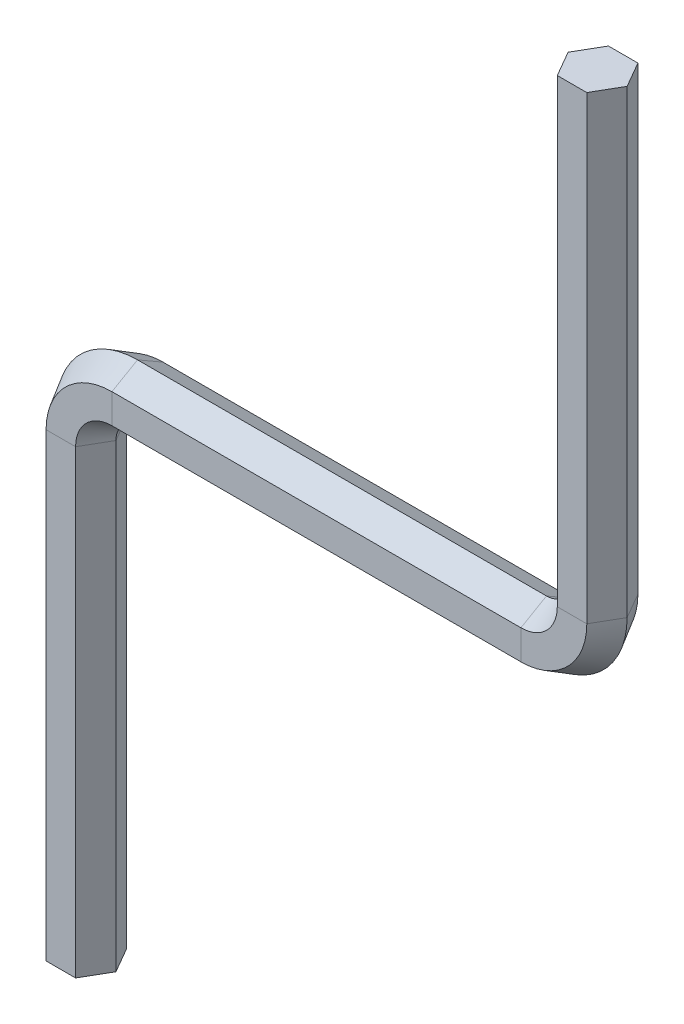
ISO-10303-21;
HEADER;
FILE_DESCRIPTION(('STEP AP214'),'2;1');
FILE_NAME('part.step','',(''),(''),'','','');
FILE_SCHEMA(('AUTOMOTIVE_DESIGN { 1 0 10303 214 1 1 1 1 }'));
ENDSEC;
DATA;
#1=APPLICATION_CONTEXT('core data for automotive mechanical design processes');
#2=APPLICATION_PROTOCOL_DEFINITION('international standard','automotive_design',2000,#1);
#3=PRODUCT_CONTEXT('',#1,'mechanical');
#4=PRODUCT('Part','Part','',(#3));
#5=PRODUCT_RELATED_PRODUCT_CATEGORY('part','',(#4));
#6=PRODUCT_DEFINITION_FORMATION('','',#4);
#7=PRODUCT_DEFINITION_CONTEXT('part definition',#1,'design');
#8=PRODUCT_DEFINITION('design','',#6,#7);
#9=PRODUCT_DEFINITION_SHAPE('','',#8);
#10=(LENGTH_UNIT() NAMED_UNIT(*) SI_UNIT(.MILLI.,.METRE.));
#11=(NAMED_UNIT(*) PLANE_ANGLE_UNIT() SI_UNIT($,.RADIAN.));
#12=(NAMED_UNIT(*) SI_UNIT($,.STERADIAN.) SOLID_ANGLE_UNIT());
#13=UNCERTAINTY_MEASURE_WITH_UNIT(LENGTH_MEASURE(1.E-05),#10,'distance_accuracy_value','');
#14=(GEOMETRIC_REPRESENTATION_CONTEXT(3) GLOBAL_UNCERTAINTY_ASSIGNED_CONTEXT((#13)) GLOBAL_UNIT_ASSIGNED_CONTEXT((#10,
#11,#12)) REPRESENTATION_CONTEXT('',''));
#15=CARTESIAN_POINT('',(0.,0.,0.));
#16=DIRECTION('',(0.,0.,1.));
#17=DIRECTION('',(1.,0.,0.));
#18=AXIS2_PLACEMENT_3D('',#15,#16,#17);
#19=CARTESIAN_POINT('',(0.,0.,0.));
#20=DIRECTION('',(0.,1.,0.));
#21=DIRECTION('',(0.,0.,1.));
#22=AXIS2_PLACEMENT_3D('',#19,#20,#21);
#23=PLANE('',#22);
#24=DIRECTION('',(0.5,0.,0.866025403784439));
#25=VECTOR('',#24,1.);
#26=CARTESIAN_POINT('',(-28.8675134594813,0.,0.));
#27=LINE('',#26,#25);
#28=CARTESIAN_POINT('',(-28.8675134594813,0.,0.));
#29=VERTEX_POINT('',#28);
#30=CARTESIAN_POINT('',(-14.4337567297407,0.,25.));
#31=VERTEX_POINT('',#30);
#32=EDGE_CURVE('E211',#29,#31,#27,.T.);
#33=ORIENTED_EDGE('',*,*,#32,.F.);
#34=DIRECTION('',(-0.5,0.,0.866025403784439));
#35=VECTOR('',#34,1.);
#36=CARTESIAN_POINT('',(-14.4337567297406,0.,-25.));
#37=LINE('',#36,#35);
#38=CARTESIAN_POINT('',(-14.4337567297406,0.,-25.));
#39=VERTEX_POINT('',#38);
#40=EDGE_CURVE('E213',#39,#29,#37,.T.);
#41=ORIENTED_EDGE('',*,*,#40,.F.);
#42=DIRECTION('',(-1.,0.,0.));
#43=VECTOR('',#42,1.);
#44=CARTESIAN_POINT('',(14.4337567297406,0.,-25.));
#45=LINE('',#44,#43);
#46=CARTESIAN_POINT('',(14.4337567297406,0.,-25.));
#47=VERTEX_POINT('',#46);
#48=EDGE_CURVE('E230',#47,#39,#45,.T.);
#49=ORIENTED_EDGE('',*,*,#48,.F.);
#50=DIRECTION('',(-0.5,0.,-0.866025403784438));
#51=VECTOR('',#50,1.);
#52=CARTESIAN_POINT('',(28.8675134594813,0.,0.));
#53=LINE('',#52,#51);
#54=CARTESIAN_POINT('',(28.8675134594813,0.,0.));
#55=VERTEX_POINT('',#54);
#56=EDGE_CURVE('E306',#55,#47,#53,.T.);
#57=ORIENTED_EDGE('',*,*,#56,.F.);
#58=DIRECTION('',(0.5,0.,-0.866025403784439));
#59=VECTOR('',#58,1.);
#60=CARTESIAN_POINT('',(14.4337567297407,0.,25.));
#61=LINE('',#60,#59);
#62=CARTESIAN_POINT('',(14.4337567297407,0.,25.));
#63=VERTEX_POINT('',#62);
#64=EDGE_CURVE('E281',#63,#55,#61,.T.);
#65=ORIENTED_EDGE('',*,*,#64,.F.);
#66=DIRECTION('',(1.,0.,0.));
#67=VECTOR('',#66,1.);
#68=CARTESIAN_POINT('',(-14.4337567297407,0.,25.));
#69=LINE('',#68,#67);
#70=EDGE_CURVE('E216',#31,#63,#69,.T.);
#71=ORIENTED_EDGE('',*,*,#70,.F.);
#72=EDGE_LOOP('',(#33,#41,#49,#57,#65,#71));
#73=FACE_BOUND('',#72,.T.);
#74=ADVANCED_FACE('F35',(#73),#23,.F.);
#75=CARTESIAN_POINT('',(500.,1000.,0.));
#76=DIRECTION('',(0.,1.,0.));
#77=DIRECTION('',(0.,0.,1.));
#78=AXIS2_PLACEMENT_3D('',#75,#76,#77);
#79=PLANE('',#78);
#80=DIRECTION('',(0.5,0.,0.866025403784439));
#81=VECTOR('',#80,1.);
#82=CARTESIAN_POINT('',(471.132486540519,1000.,0.));
#83=LINE('',#82,#81);
#84=CARTESIAN_POINT('',(471.132486540519,1000.,0.));
#85=VERTEX_POINT('',#84);
#86=CARTESIAN_POINT('',(485.566243270259,1000.,25.));
#87=VERTEX_POINT('',#86);
#88=EDGE_CURVE('E270',#85,#87,#83,.T.);
#89=ORIENTED_EDGE('',*,*,#88,.T.);
#90=DIRECTION('',(1.,0.,0.));
#91=VECTOR('',#90,1.);
#92=CARTESIAN_POINT('',(485.566243270259,1000.,25.));
#93=LINE('',#92,#91);
#94=CARTESIAN_POINT('',(514.433756729741,1000.,25.));
#95=VERTEX_POINT('',#94);
#96=EDGE_CURVE('E276',#87,#95,#93,.T.);
#97=ORIENTED_EDGE('',*,*,#96,.T.);
#98=DIRECTION('',(0.5,0.,-0.866025403784439));
#99=VECTOR('',#98,1.);
#100=CARTESIAN_POINT('',(514.433756729741,1000.,25.));
#101=LINE('',#100,#99);
#102=CARTESIAN_POINT('',(528.867513459481,1000.,0.));
#103=VERTEX_POINT('',#102);
#104=EDGE_CURVE('E303',#95,#103,#101,.T.);
#105=ORIENTED_EDGE('',*,*,#104,.T.);
#106=DIRECTION('',(-0.5,0.,-0.866025403784438));
#107=VECTOR('',#106,1.);
#108=CARTESIAN_POINT('',(528.867513459481,1000.,0.));
#109=LINE('',#108,#107);
#110=CARTESIAN_POINT('',(514.433756729741,1000.,-25.));
#111=VERTEX_POINT('',#110);
#112=EDGE_CURVE('E54',#103,#111,#109,.T.);
#113=ORIENTED_EDGE('',*,*,#112,.T.);
#114=DIRECTION('',(-1.,0.,0.));
#115=VECTOR('',#114,1.);
#116=CARTESIAN_POINT('',(514.433756729741,1000.,-25.));
#117=LINE('',#116,#115);
#118=CARTESIAN_POINT('',(485.566243270259,1000.,-25.));
#119=VERTEX_POINT('',#118);
#120=EDGE_CURVE('E48',#111,#119,#117,.T.);
#121=ORIENTED_EDGE('',*,*,#120,.T.);
#122=DIRECTION('',(-0.5,0.,0.866025403784439));
#123=VECTOR('',#122,1.);
#124=CARTESIAN_POINT('',(485.566243270259,1000.,-25.));
#125=LINE('',#124,#123);
#126=EDGE_CURVE('E11',#119,#85,#125,.T.);
#127=ORIENTED_EDGE('',*,*,#126,.T.);
#128=EDGE_LOOP('',(#89,#97,#105,#113,#121,#127));
#129=FACE_BOUND('',#128,.T.);
#130=ADVANCED_FACE('F418',(#129),#79,.T.);
#131=CARTESIAN_POINT('',(-28.8675134594813,0.,0.));
#132=DIRECTION('',(-0.866025403784439,0.,0.5));
#133=DIRECTION('',(0.5,0.,0.866025403784439));
#134=AXIS2_PLACEMENT_3D('',#131,#132,#133);
#135=PLANE('',#134);
#136=DIRECTION('',(0.,1.,0.));
#137=VECTOR('',#136,1.);
#138=CARTESIAN_POINT('',(-14.4337567297407,0.,25.));
#139=LINE('',#138,#137);
#140=CARTESIAN_POINT('',(-14.4337567297407,450.,25.));
#141=VERTEX_POINT('',#140);
#142=EDGE_CURVE('E237',#31,#141,#139,.T.);
#143=ORIENTED_EDGE('',*,*,#142,.T.);
#144=DIRECTION('',(0.5,0.,0.866025403784439));
#145=VECTOR('',#144,1.);
#146=CARTESIAN_POINT('',(-28.8675134594813,450.,0.));
#147=LINE('',#146,#145);
#148=CARTESIAN_POINT('',(-28.8675134594813,450.,0.));
#149=VERTEX_POINT('',#148);
#150=EDGE_CURVE('E235',#149,#141,#147,.T.);
#151=ORIENTED_EDGE('',*,*,#150,.F.);
#152=DIRECTION('',(0.,1.,0.));
#153=VECTOR('',#152,1.);
#154=CARTESIAN_POINT('',(-28.8675134594813,0.,0.));
#155=LINE('',#154,#153);
#156=EDGE_CURVE('E227',#29,#149,#155,.T.);
#157=ORIENTED_EDGE('',*,*,#156,.F.);
#158=ORIENTED_EDGE('',*,*,#32,.T.);
#159=EDGE_LOOP('',(#143,#151,#157,#158));
#160=FACE_BOUND('',#159,.T.);
#161=ADVANCED_FACE('F233',(#160),#135,.T.);
#162=CARTESIAN_POINT('',(-14.4337567297407,0.,25.));
#163=DIRECTION('',(0.,0.,1.));
#164=DIRECTION('',(1.,0.,0.));
#165=AXIS2_PLACEMENT_3D('',#162,#163,#164);
#166=PLANE('',#165);
#167=DIRECTION('',(0.,1.,0.));
#168=VECTOR('',#167,1.);
#169=CARTESIAN_POINT('',(14.4337567297407,0.,25.));
#170=LINE('',#169,#168);
#171=CARTESIAN_POINT('',(14.4337567297407,450.,25.));
#172=VERTEX_POINT('',#171);
#173=EDGE_CURVE('E284',#63,#172,#170,.T.);
#174=ORIENTED_EDGE('',*,*,#173,.T.);
#175=DIRECTION('',(1.,0.,0.));
#176=VECTOR('',#175,1.);
#177=CARTESIAN_POINT('',(-14.4337567297407,450.,25.));
#178=LINE('',#177,#176);
#179=EDGE_CURVE('E282',#141,#172,#178,.T.);
#180=ORIENTED_EDGE('',*,*,#179,.F.);
#181=ORIENTED_EDGE('',*,*,#142,.F.);
#182=ORIENTED_EDGE('',*,*,#70,.T.);
#183=EDGE_LOOP('',(#174,#180,#181,#182));
#184=FACE_BOUND('',#183,.T.);
#185=ADVANCED_FACE('F445',(#184),#166,.T.);
#186=CARTESIAN_POINT('',(14.4337567297407,0.,25.));
#187=DIRECTION('',(0.866025403784439,0.,0.5));
#188=DIRECTION('',(0.5,0.,-0.866025403784439));
#189=AXIS2_PLACEMENT_3D('',#186,#187,#188);
#190=PLANE('',#189);
#191=DIRECTION('',(0.,1.,0.));
#192=VECTOR('',#191,1.);
#193=CARTESIAN_POINT('',(28.8675134594813,0.,0.));
#194=LINE('',#193,#192);
#195=CARTESIAN_POINT('',(28.8675134594813,450.,0.));
#196=VERTEX_POINT('',#195);
#197=EDGE_CURVE('E308',#55,#196,#194,.T.);
#198=ORIENTED_EDGE('',*,*,#197,.T.);
#199=DIRECTION('',(0.5,0.,-0.866025403784439));
#200=VECTOR('',#199,1.);
#201=CARTESIAN_POINT('',(14.4337567297407,450.,25.));
#202=LINE('',#201,#200);
#203=EDGE_CURVE('E287',#172,#196,#202,.T.);
#204=ORIENTED_EDGE('',*,*,#203,.F.);
#205=ORIENTED_EDGE('',*,*,#173,.F.);
#206=ORIENTED_EDGE('',*,*,#64,.T.);
#207=EDGE_LOOP('',(#198,#204,#205,#206));
#208=FACE_BOUND('',#207,.T.);
#209=ADVANCED_FACE('F468',(#208),#190,.T.);
#210=CARTESIAN_POINT('',(28.8675134594813,0.,0.));
#211=DIRECTION('',(0.866025403784439,0.,-0.5));
#212=DIRECTION('',(-0.5,0.,-0.866025403784438));
#213=AXIS2_PLACEMENT_3D('',#210,#211,#212);
#214=PLANE('',#213);
#215=DIRECTION('',(0.,1.,0.));
#216=VECTOR('',#215,1.);
#217=CARTESIAN_POINT('',(14.4337567297406,0.,-25.));
#218=LINE('',#217,#216);
#219=CARTESIAN_POINT('',(14.4337567297406,450.,-25.));
#220=VERTEX_POINT('',#219);
#221=EDGE_CURVE('E330',#47,#220,#218,.T.);
#222=ORIENTED_EDGE('',*,*,#221,.T.);
#223=DIRECTION('',(-0.5,0.,-0.866025403784438));
#224=VECTOR('',#223,1.);
#225=CARTESIAN_POINT('',(28.8675134594813,450.,0.));
#226=LINE('',#225,#224);
#227=EDGE_CURVE('E311',#196,#220,#226,.T.);
#228=ORIENTED_EDGE('',*,*,#227,.F.);
#229=ORIENTED_EDGE('',*,*,#197,.F.);
#230=ORIENTED_EDGE('',*,*,#56,.T.);
#231=EDGE_LOOP('',(#222,#228,#229,#230));
#232=FACE_BOUND('',#231,.T.);
#233=ADVANCED_FACE('F478',(#232),#214,.T.);
#234=CARTESIAN_POINT('',(14.4337567297406,0.,-25.));
#235=DIRECTION('',(0.,0.,-1.));
#236=DIRECTION('',(-1.,0.,0.));
#237=AXIS2_PLACEMENT_3D('',#234,#235,#236);
#238=PLANE('',#237);
#239=DIRECTION('',(0.,1.,0.));
#240=VECTOR('',#239,1.);
#241=CARTESIAN_POINT('',(-14.4337567297406,0.,-25.));
#242=LINE('',#241,#240);
#243=CARTESIAN_POINT('',(-14.4337567297406,450.,-25.));
#244=VERTEX_POINT('',#243);
#245=EDGE_CURVE('E229',#39,#244,#242,.T.);
#246=ORIENTED_EDGE('',*,*,#245,.T.);
#247=DIRECTION('',(-1.,0.,0.));
#248=VECTOR('',#247,1.);
#249=CARTESIAN_POINT('',(14.4337567297406,450.,-25.));
#250=LINE('',#249,#248);
#251=EDGE_CURVE('E333',#220,#244,#250,.T.);
#252=ORIENTED_EDGE('',*,*,#251,.F.);
#253=ORIENTED_EDGE('',*,*,#221,.F.);
#254=ORIENTED_EDGE('',*,*,#48,.T.);
#255=EDGE_LOOP('',(#246,#252,#253,#254));
#256=FACE_BOUND('',#255,.T.);
#257=ADVANCED_FACE('F394',(#256),#238,.T.);
#258=CARTESIAN_POINT('',(-14.4337567297406,0.,-25.));
#259=DIRECTION('',(-0.866025403784439,0.,-0.5));
#260=DIRECTION('',(-0.5,0.,0.866025403784439));
#261=AXIS2_PLACEMENT_3D('',#258,#259,#260);
#262=PLANE('',#261);
#263=DIRECTION('',(-0.5,0.,0.866025403784439));
#264=VECTOR('',#263,1.);
#265=CARTESIAN_POINT('',(-14.4337567297406,450.,-25.));
#266=LINE('',#265,#264);
#267=EDGE_CURVE('E249',#244,#149,#266,.T.);
#268=ORIENTED_EDGE('',*,*,#267,.F.);
#269=ORIENTED_EDGE('',*,*,#245,.F.);
#270=ORIENTED_EDGE('',*,*,#40,.T.);
#271=ORIENTED_EDGE('',*,*,#156,.T.);
#272=EDGE_LOOP('',(#268,#269,#270,#271));
#273=FACE_BOUND('',#272,.T.);
#274=ADVANCED_FACE('F226',(#273),#262,.T.);
#275=CARTESIAN_POINT('',(50.,450.,0.));
#276=DIRECTION('',(0.,0.,-1.));
#277=DIRECTION('',(-1.,0.,0.));
#278=AXIS2_PLACEMENT_3D('',#275,#276,#277);
#279=CONICAL_SURFACE('',#278,78.8675134594813,0.523598775598299);
#280=CARTESIAN_POINT('',(50.,450.,25.));
#281=DIRECTION('',(0.,0.,-1.));
#282=DIRECTION('',(-1.,0.,0.));
#283=AXIS2_PLACEMENT_3D('',#280,#281,#282);
#284=CIRCLE('',#283,64.4337567297406);
#285=CARTESIAN_POINT('',(50.0000000000004,514.433756729741,25.));
#286=VERTEX_POINT('',#285);
#287=EDGE_CURVE('E200',#141,#286,#284,.T.);
#288=ORIENTED_EDGE('',*,*,#287,.T.);
#289=DIRECTION('',(0.,-0.5,0.866025403784439));
#290=VECTOR('',#289,1.);
#291=CARTESIAN_POINT('',(50.0000000000005,528.867513459481,0.));
#292=LINE('',#291,#290);
#293=CARTESIAN_POINT('',(50.0000000000006,528.867513459481,0.));
#294=VERTEX_POINT('',#293);
#295=EDGE_CURVE('E241',#294,#286,#292,.T.);
#296=ORIENTED_EDGE('',*,*,#295,.F.);
#297=CARTESIAN_POINT('',(50.,450.,0.));
#298=DIRECTION('',(0.,0.,-1.));
#299=DIRECTION('',(-1.,0.,0.));
#300=AXIS2_PLACEMENT_3D('',#297,#298,#299);
#301=CIRCLE('',#300,78.8675134594813);
#302=EDGE_CURVE('E244',#149,#294,#301,.T.);
#303=ORIENTED_EDGE('',*,*,#302,.F.);
#304=ORIENTED_EDGE('',*,*,#150,.T.);
#305=EDGE_LOOP('',(#288,#296,#303,#304));
#306=FACE_BOUND('',#305,.T.);
#307=ADVANCED_FACE('F390',(#306),#279,.T.);
#308=CARTESIAN_POINT('',(-14.4337567297406,450.,25.));
#309=DIRECTION('',(0.,0.,1.));
#310=DIRECTION('',(1.,0.,0.));
#311=AXIS2_PLACEMENT_3D('',#308,#309,#310);
#312=PLANE('',#311);
#313=CARTESIAN_POINT('',(50.,450.,25.));
#314=DIRECTION('',(0.,0.,-1.));
#315=DIRECTION('',(-1.,0.,0.));
#316=AXIS2_PLACEMENT_3D('',#313,#314,#315);
#317=CIRCLE('',#316,35.5662432702593);
#318=CARTESIAN_POINT('',(50.0000000000002,485.566243270259,25.));
#319=VERTEX_POINT('',#318);
#320=EDGE_CURVE('E194',#172,#319,#317,.T.);
#321=ORIENTED_EDGE('',*,*,#320,.T.);
#322=DIRECTION('',(0.,-1.,0.));
#323=VECTOR('',#322,1.);
#324=CARTESIAN_POINT('',(50.0000000000004,514.433756729741,25.));
#325=LINE('',#324,#323);
#326=EDGE_CURVE('E246',#286,#319,#325,.T.);
#327=ORIENTED_EDGE('',*,*,#326,.F.);
#328=ORIENTED_EDGE('',*,*,#287,.F.);
#329=ORIENTED_EDGE('',*,*,#179,.T.);
#330=EDGE_LOOP('',(#321,#327,#328,#329));
#331=FACE_BOUND('',#330,.T.);
#332=ADVANCED_FACE('F513',(#331),#312,.T.);
#333=CARTESIAN_POINT('',(50.,450.,25.));
#334=DIRECTION('',(0.,0.,1.));
#335=DIRECTION('',(1.,0.,0.));
#336=AXIS2_PLACEMENT_3D('',#333,#334,#335);
#337=CONICAL_SURFACE('',#336,35.5662432702593,0.523598775598299);
#338=CARTESIAN_POINT('',(50.,450.,0.));
#339=DIRECTION('',(0.,0.,-1.));
#340=DIRECTION('',(-1.,0.,0.));
#341=AXIS2_PLACEMENT_3D('',#338,#339,#340);
#342=CIRCLE('',#341,21.1324865405187);
#343=CARTESIAN_POINT('',(50.0000000000001,471.132486540519,0.));
#344=VERTEX_POINT('',#343);
#345=EDGE_CURVE('E313',#196,#344,#342,.T.);
#346=ORIENTED_EDGE('',*,*,#345,.T.);
#347=DIRECTION('',(0.,-0.5,-0.866025403784439));
#348=VECTOR('',#347,1.);
#349=CARTESIAN_POINT('',(50.0000000000002,485.566243270259,25.));
#350=LINE('',#349,#348);
#351=EDGE_CURVE('E290',#319,#344,#350,.T.);
#352=ORIENTED_EDGE('',*,*,#351,.F.);
#353=ORIENTED_EDGE('',*,*,#320,.F.);
#354=ORIENTED_EDGE('',*,*,#203,.T.);
#355=EDGE_LOOP('',(#346,#352,#353,#354));
#356=FACE_BOUND('',#355,.T.);
#357=ADVANCED_FACE('F522',(#356),#337,.F.);
#358=CARTESIAN_POINT('',(50.,450.,0.));
#359=DIRECTION('',(0.,0.,-1.));
#360=DIRECTION('',(-1.,0.,0.));
#361=AXIS2_PLACEMENT_3D('',#358,#359,#360);
#362=CONICAL_SURFACE('',#361,21.1324865405187,0.523598775598299);
#363=CARTESIAN_POINT('',(50.,450.,-25.));
#364=DIRECTION('',(0.,0.,-1.));
#365=DIRECTION('',(-1.,0.,0.));
#366=AXIS2_PLACEMENT_3D('',#363,#364,#365);
#367=CIRCLE('',#366,35.5662432702594);
#368=CARTESIAN_POINT('',(50.0000000000002,485.566243270259,-25.));
#369=VERTEX_POINT('',#368);
#370=EDGE_CURVE('E335',#220,#369,#367,.T.);
#371=ORIENTED_EDGE('',*,*,#370,.T.);
#372=DIRECTION('',(0.,0.5,-0.866025403784438));
#373=VECTOR('',#372,1.);
#374=CARTESIAN_POINT('',(50.0000000000001,471.132486540519,0.));
#375=LINE('',#374,#373);
#376=EDGE_CURVE('E316',#344,#369,#375,.T.);
#377=ORIENTED_EDGE('',*,*,#376,.F.);
#378=ORIENTED_EDGE('',*,*,#345,.F.);
#379=ORIENTED_EDGE('',*,*,#227,.T.);
#380=EDGE_LOOP('',(#371,#377,#378,#379));
#381=FACE_BOUND('',#380,.T.);
#382=ADVANCED_FACE('F400',(#381),#362,.F.);
#383=CARTESIAN_POINT('',(14.4337567297406,450.,-25.));
#384=DIRECTION('',(0.,0.,-1.));
#385=DIRECTION('',(-1.,0.,0.));
#386=AXIS2_PLACEMENT_3D('',#383,#384,#385);
#387=PLANE('',#386);
#388=CARTESIAN_POINT('',(50.,450.,-25.));
#389=DIRECTION('',(0.,0.,-1.));
#390=DIRECTION('',(-1.,0.,0.));
#391=AXIS2_PLACEMENT_3D('',#388,#389,#390);
#392=CIRCLE('',#391,64.4337567297406);
#393=CARTESIAN_POINT('',(50.0000000000004,514.433756729741,-25.));
#394=VERTEX_POINT('',#393);
#395=EDGE_CURVE('E355',#244,#394,#392,.T.);
#396=ORIENTED_EDGE('',*,*,#395,.T.);
#397=DIRECTION('',(0.,1.,0.));
#398=VECTOR('',#397,1.);
#399=CARTESIAN_POINT('',(50.0000000000002,485.566243270259,-25.));
#400=LINE('',#399,#398);
#401=EDGE_CURVE('E338',#369,#394,#400,.T.);
#402=ORIENTED_EDGE('',*,*,#401,.F.);
#403=ORIENTED_EDGE('',*,*,#370,.F.);
#404=ORIENTED_EDGE('',*,*,#251,.T.);
#405=EDGE_LOOP('',(#396,#402,#403,#404));
#406=FACE_BOUND('',#405,.T.);
#407=ADVANCED_FACE('F397',(#406),#387,.T.);
#408=CARTESIAN_POINT('',(50.,450.,-25.));
#409=DIRECTION('',(0.,0.,1.));
#410=DIRECTION('',(1.,0.,0.));
#411=AXIS2_PLACEMENT_3D('',#408,#409,#410);
#412=CONICAL_SURFACE('',#411,64.4337567297406,0.523598775598299);
#413=DIRECTION('',(0.,0.5,0.866025403784439));
#414=VECTOR('',#413,1.);
#415=CARTESIAN_POINT('',(50.0000000000004,514.433756729741,-25.));
#416=LINE('',#415,#414);
#417=EDGE_CURVE('E258',#394,#294,#416,.T.);
#418=ORIENTED_EDGE('',*,*,#417,.F.);
#419=ORIENTED_EDGE('',*,*,#395,.F.);
#420=ORIENTED_EDGE('',*,*,#267,.T.);
#421=ORIENTED_EDGE('',*,*,#302,.T.);
#422=EDGE_LOOP('',(#418,#419,#420,#421));
#423=FACE_BOUND('',#422,.T.);
#424=ADVANCED_FACE('F391',(#423),#412,.T.);
#425=CARTESIAN_POINT('',(50.0000000000004,528.867513459481,0.));
#426=DIRECTION('',(0.,0.866025403784439,0.5));
#427=DIRECTION('',(0.,-0.5,0.866025403784439));
#428=AXIS2_PLACEMENT_3D('',#425,#426,#427);
#429=PLANE('',#428);
#430=DIRECTION('',(1.,0.,0.));
#431=VECTOR('',#430,1.);
#432=CARTESIAN_POINT('',(50.0000000000004,514.433756729741,25.));
#433=LINE('',#432,#431);
#434=CARTESIAN_POINT('',(450.,514.433756729741,25.));
#435=VERTEX_POINT('',#434);
#436=EDGE_CURVE('E173',#286,#435,#433,.T.);
#437=ORIENTED_EDGE('',*,*,#436,.T.);
#438=DIRECTION('',(0.,-0.5,0.866025403784439));
#439=VECTOR('',#438,1.);
#440=CARTESIAN_POINT('',(450.,528.867513459481,0.));
#441=LINE('',#440,#439);
#442=CARTESIAN_POINT('',(450.,528.867513459481,0.));
#443=VERTEX_POINT('',#442);
#444=EDGE_CURVE('E250',#443,#435,#441,.T.);
#445=ORIENTED_EDGE('',*,*,#444,.F.);
#446=DIRECTION('',(1.,0.,0.));
#447=VECTOR('',#446,1.);
#448=CARTESIAN_POINT('',(50.0000000000004,528.867513459481,0.));
#449=LINE('',#448,#447);
#450=EDGE_CURVE('E253',#294,#443,#449,.T.);
#451=ORIENTED_EDGE('',*,*,#450,.F.);
#452=ORIENTED_EDGE('',*,*,#295,.T.);
#453=EDGE_LOOP('',(#437,#445,#451,#452));
#454=FACE_BOUND('',#453,.T.);
#455=ADVANCED_FACE('F384',(#454),#429,.T.);
#456=CARTESIAN_POINT('',(50.0000000000004,514.433756729741,25.));
#457=DIRECTION('',(0.,0.,1.));
#458=DIRECTION('',(0.,-1.,0.));
#459=AXIS2_PLACEMENT_3D('',#456,#457,#458);
#460=PLANE('',#459);
#461=DIRECTION('',(1.,0.,0.));
#462=VECTOR('',#461,1.);
#463=CARTESIAN_POINT('',(50.0000000000004,485.566243270259,25.));
#464=LINE('',#463,#462);
#465=CARTESIAN_POINT('',(450.,485.566243270259,25.));
#466=VERTEX_POINT('',#465);
#467=EDGE_CURVE('E165',#319,#466,#464,.T.);
#468=ORIENTED_EDGE('',*,*,#467,.T.);
#469=DIRECTION('',(0.,-1.,0.));
#470=VECTOR('',#469,1.);
#471=CARTESIAN_POINT('',(450.,514.433756729741,25.));
#472=LINE('',#471,#470);
#473=EDGE_CURVE('E255',#435,#466,#472,.T.);
#474=ORIENTED_EDGE('',*,*,#473,.F.);
#475=ORIENTED_EDGE('',*,*,#436,.F.);
#476=ORIENTED_EDGE('',*,*,#326,.T.);
#477=EDGE_LOOP('',(#468,#474,#475,#476));
#478=FACE_BOUND('',#477,.T.);
#479=ADVANCED_FACE('F562',(#478),#460,.T.);
#480=CARTESIAN_POINT('',(50.0000000000004,485.566243270259,25.));
#481=DIRECTION('',(0.,-0.866025403784439,0.5));
#482=DIRECTION('',(0.,-0.5,-0.866025403784439));
#483=AXIS2_PLACEMENT_3D('',#480,#481,#482);
#484=PLANE('',#483);
#485=DIRECTION('',(1.,0.,0.));
#486=VECTOR('',#485,1.);
#487=CARTESIAN_POINT('',(50.0000000000004,471.132486540519,0.));
#488=LINE('',#487,#486);
#489=CARTESIAN_POINT('',(450.,471.132486540519,0.));
#490=VERTEX_POINT('',#489);
#491=EDGE_CURVE('E158',#344,#490,#488,.T.);
#492=ORIENTED_EDGE('',*,*,#491,.T.);
#493=DIRECTION('',(0.,-0.5,-0.866025403784439));
#494=VECTOR('',#493,1.);
#495=CARTESIAN_POINT('',(450.,485.566243270259,25.));
#496=LINE('',#495,#494);
#497=EDGE_CURVE('E294',#466,#490,#496,.T.);
#498=ORIENTED_EDGE('',*,*,#497,.F.);
#499=ORIENTED_EDGE('',*,*,#467,.F.);
#500=ORIENTED_EDGE('',*,*,#351,.T.);
#501=EDGE_LOOP('',(#492,#498,#499,#500));
#502=FACE_BOUND('',#501,.T.);
#503=ADVANCED_FACE('F429',(#502),#484,.T.);
#504=CARTESIAN_POINT('',(50.0000000000004,471.132486540519,0.));
#505=DIRECTION('',(0.,-0.866025403784438,-0.5));
#506=DIRECTION('',(0.,0.5,-0.866025403784439));
#507=AXIS2_PLACEMENT_3D('',#504,#505,#506);
#508=PLANE('',#507);
#509=DIRECTION('',(1.,0.,0.));
#510=VECTOR('',#509,1.);
#511=CARTESIAN_POINT('',(50.0000000000004,485.566243270259,-25.));
#512=LINE('',#511,#510);
#513=CARTESIAN_POINT('',(450.,485.566243270259,-25.));
#514=VERTEX_POINT('',#513);
#515=EDGE_CURVE('E340',#369,#514,#512,.T.);
#516=ORIENTED_EDGE('',*,*,#515,.T.);
#517=DIRECTION('',(0.,0.5,-0.866025403784438));
#518=VECTOR('',#517,1.);
#519=CARTESIAN_POINT('',(450.,471.132486540519,0.));
#520=LINE('',#519,#518);
#521=EDGE_CURVE('E319',#490,#514,#520,.T.);
#522=ORIENTED_EDGE('',*,*,#521,.F.);
#523=ORIENTED_EDGE('',*,*,#491,.F.);
#524=ORIENTED_EDGE('',*,*,#376,.T.);
#525=EDGE_LOOP('',(#516,#522,#523,#524));
#526=FACE_BOUND('',#525,.T.);
#527=ADVANCED_FACE('F402',(#526),#508,.T.);
#528=CARTESIAN_POINT('',(50.0000000000004,485.566243270259,-25.));
#529=DIRECTION('',(0.,0.,-1.));
#530=DIRECTION('',(0.,1.,0.));
#531=AXIS2_PLACEMENT_3D('',#528,#529,#530);
#532=PLANE('',#531);
#533=DIRECTION('',(1.,0.,0.));
#534=VECTOR('',#533,1.);
#535=CARTESIAN_POINT('',(50.0000000000004,514.433756729741,-25.));
#536=LINE('',#535,#534);
#537=CARTESIAN_POINT('',(450.,514.433756729741,-25.));
#538=VERTEX_POINT('',#537);
#539=EDGE_CURVE('E359',#394,#538,#536,.T.);
#540=ORIENTED_EDGE('',*,*,#539,.T.);
#541=DIRECTION('',(0.,1.,0.));
#542=VECTOR('',#541,1.);
#543=CARTESIAN_POINT('',(450.,485.566243270259,-25.));
#544=LINE('',#543,#542);
#545=EDGE_CURVE('E343',#514,#538,#544,.T.);
#546=ORIENTED_EDGE('',*,*,#545,.F.);
#547=ORIENTED_EDGE('',*,*,#515,.F.);
#548=ORIENTED_EDGE('',*,*,#401,.T.);
#549=EDGE_LOOP('',(#540,#546,#547,#548));
#550=FACE_BOUND('',#549,.T.);
#551=ADVANCED_FACE('F421',(#550),#532,.T.);
#552=CARTESIAN_POINT('',(50.0000000000004,514.433756729741,-25.));
#553=DIRECTION('',(0.,0.866025403784439,-0.5));
#554=DIRECTION('',(0.,0.5,0.866025403784439));
#555=AXIS2_PLACEMENT_3D('',#552,#553,#554);
#556=PLANE('',#555);
#557=DIRECTION('',(0.,0.5,0.866025403784439));
#558=VECTOR('',#557,1.);
#559=CARTESIAN_POINT('',(450.,514.433756729741,-25.));
#560=LINE('',#559,#558);
#561=EDGE_CURVE('E269',#538,#443,#560,.T.);
#562=ORIENTED_EDGE('',*,*,#561,.F.);
#563=ORIENTED_EDGE('',*,*,#539,.F.);
#564=ORIENTED_EDGE('',*,*,#417,.T.);
#565=ORIENTED_EDGE('',*,*,#450,.T.);
#566=EDGE_LOOP('',(#562,#563,#564,#565));
#567=FACE_BOUND('',#566,.T.);
#568=ADVANCED_FACE('F385',(#567),#556,.T.);
#569=CARTESIAN_POINT('',(450.,550.,0.));
#570=DIRECTION('',(0.,0.,1.));
#571=DIRECTION('',(1.,0.,0.));
#572=AXIS2_PLACEMENT_3D('',#569,#570,#571);
#573=CONICAL_SURFACE('',#572,21.1324865405188,0.5235987755983);
#574=CARTESIAN_POINT('',(450.,550.,25.));
#575=DIRECTION('',(0.,0.,1.));
#576=DIRECTION('',(0.,-1.,0.));
#577=AXIS2_PLACEMENT_3D('',#574,#575,#576);
#578=CIRCLE('',#577,35.5662432702594);
#579=CARTESIAN_POINT('',(485.566243270259,550.,25.));
#580=VERTEX_POINT('',#579);
#581=EDGE_CURVE('E262',#435,#580,#578,.T.);
#582=ORIENTED_EDGE('',*,*,#581,.T.);
#583=DIRECTION('',(0.5,0.,0.866025403784439));
#584=VECTOR('',#583,1.);
#585=CARTESIAN_POINT('',(471.132486540519,550.,0.));
#586=LINE('',#585,#584);
#587=CARTESIAN_POINT('',(471.132486540519,550.,0.));
#588=VERTEX_POINT('',#587);
#589=EDGE_CURVE('E259',#588,#580,#586,.T.);
#590=ORIENTED_EDGE('',*,*,#589,.F.);
#591=CARTESIAN_POINT('',(450.,550.,0.));
#592=DIRECTION('',(0.,0.,1.));
#593=DIRECTION('',(0.,-1.,0.));
#594=AXIS2_PLACEMENT_3D('',#591,#592,#593);
#595=CIRCLE('',#594,21.1324865405188);
#596=EDGE_CURVE('E263',#443,#588,#595,.T.);
#597=ORIENTED_EDGE('',*,*,#596,.F.);
#598=ORIENTED_EDGE('',*,*,#444,.T.);
#599=EDGE_LOOP('',(#582,#590,#597,#598));
#600=FACE_BOUND('',#599,.T.);
#601=ADVANCED_FACE('F377',(#600),#573,.F.);
#602=CARTESIAN_POINT('',(450.,514.433756729741,25.));
#603=DIRECTION('',(0.,0.,1.));
#604=DIRECTION('',(1.,0.,0.));
#605=AXIS2_PLACEMENT_3D('',#602,#603,#604);
#606=PLANE('',#605);
#607=CARTESIAN_POINT('',(450.,550.,25.));
#608=DIRECTION('',(0.,0.,1.));
#609=DIRECTION('',(0.,-1.,0.));
#610=AXIS2_PLACEMENT_3D('',#607,#608,#609);
#611=CIRCLE('',#610,64.4337567297407);
#612=CARTESIAN_POINT('',(514.433756729741,550.,25.));
#613=VERTEX_POINT('',#612);
#614=EDGE_CURVE('E139',#466,#613,#611,.T.);
#615=ORIENTED_EDGE('',*,*,#614,.T.);
#616=DIRECTION('',(1.,0.,0.));
#617=VECTOR('',#616,1.);
#618=CARTESIAN_POINT('',(485.566243270259,550.,25.));
#619=LINE('',#618,#617);
#620=EDGE_CURVE('E266',#580,#613,#619,.T.);
#621=ORIENTED_EDGE('',*,*,#620,.F.);
#622=ORIENTED_EDGE('',*,*,#581,.F.);
#623=ORIENTED_EDGE('',*,*,#473,.T.);
#624=EDGE_LOOP('',(#615,#621,#622,#623));
#625=FACE_BOUND('',#624,.T.);
#626=ADVANCED_FACE('F412',(#625),#606,.T.);
#627=CARTESIAN_POINT('',(450.,550.,25.));
#628=DIRECTION('',(0.,0.,-1.));
#629=DIRECTION('',(-1.,0.,0.));
#630=AXIS2_PLACEMENT_3D('',#627,#628,#629);
#631=CONICAL_SURFACE('',#630,64.4337567297407,0.523598775598298);
#632=CARTESIAN_POINT('',(450.,550.,0.));
#633=DIRECTION('',(0.,0.,1.));
#634=DIRECTION('',(0.,-1.,0.));
#635=AXIS2_PLACEMENT_3D('',#632,#633,#634);
#636=CIRCLE('',#635,78.8675134594813);
#637=CARTESIAN_POINT('',(528.867513459481,550.,0.));
#638=VERTEX_POINT('',#637);
#639=EDGE_CURVE('E130',#490,#638,#636,.T.);
#640=ORIENTED_EDGE('',*,*,#639,.T.);
#641=DIRECTION('',(0.5,0.,-0.866025403784439));
#642=VECTOR('',#641,1.);
#643=CARTESIAN_POINT('',(514.433756729741,550.,25.));
#644=LINE('',#643,#642);
#645=EDGE_CURVE('E298',#613,#638,#644,.T.);
#646=ORIENTED_EDGE('',*,*,#645,.F.);
#647=ORIENTED_EDGE('',*,*,#614,.F.);
#648=ORIENTED_EDGE('',*,*,#497,.T.);
#649=EDGE_LOOP('',(#640,#646,#647,#648));
#650=FACE_BOUND('',#649,.T.);
#651=ADVANCED_FACE('F409',(#650),#631,.T.);
#652=CARTESIAN_POINT('',(450.,550.,0.));
#653=DIRECTION('',(0.,0.,1.));
#654=DIRECTION('',(1.,0.,0.));
#655=AXIS2_PLACEMENT_3D('',#652,#653,#654);
#656=CONICAL_SURFACE('',#655,78.8675134594813,0.523598775598298);
#657=CARTESIAN_POINT('',(450.,550.,-25.));
#658=DIRECTION('',(0.,0.,1.));
#659=DIRECTION('',(0.,-1.,0.));
#660=AXIS2_PLACEMENT_3D('',#657,#658,#659);
#661=CIRCLE('',#660,64.4337567297407);
#662=CARTESIAN_POINT('',(514.433756729741,550.,-25.));
#663=VERTEX_POINT('',#662);
#664=EDGE_CURVE('E123',#514,#663,#661,.T.);
#665=ORIENTED_EDGE('',*,*,#664,.T.);
#666=DIRECTION('',(-0.5,0.,-0.866025403784438));
#667=VECTOR('',#666,1.);
#668=CARTESIAN_POINT('',(528.867513459481,550.,0.));
#669=LINE('',#668,#667);
#670=EDGE_CURVE('E323',#638,#663,#669,.T.);
#671=ORIENTED_EDGE('',*,*,#670,.F.);
#672=ORIENTED_EDGE('',*,*,#639,.F.);
#673=ORIENTED_EDGE('',*,*,#521,.T.);
#674=EDGE_LOOP('',(#665,#671,#672,#673));
#675=FACE_BOUND('',#674,.T.);
#676=ADVANCED_FACE('F404',(#675),#656,.T.);
#677=CARTESIAN_POINT('',(449.999999999999,485.566243270259,-25.));
#678=DIRECTION('',(0.,0.,-1.));
#679=DIRECTION('',(-1.,0.,0.));
#680=AXIS2_PLACEMENT_3D('',#677,#678,#679);
#681=PLANE('',#680);
#682=CARTESIAN_POINT('',(450.,550.,-25.));
#683=DIRECTION('',(0.,0.,1.));
#684=DIRECTION('',(0.,-1.,0.));
#685=AXIS2_PLACEMENT_3D('',#682,#683,#684);
#686=CIRCLE('',#685,35.5662432702594);
#687=CARTESIAN_POINT('',(485.566243270259,550.,-25.));
#688=VERTEX_POINT('',#687);
#689=EDGE_CURVE('E363',#538,#688,#686,.T.);
#690=ORIENTED_EDGE('',*,*,#689,.T.);
#691=DIRECTION('',(-1.,0.,0.));
#692=VECTOR('',#691,1.);
#693=CARTESIAN_POINT('',(514.433756729741,550.,-25.));
#694=LINE('',#693,#692);
#695=EDGE_CURVE('E346',#663,#688,#694,.T.);
#696=ORIENTED_EDGE('',*,*,#695,.F.);
#697=ORIENTED_EDGE('',*,*,#664,.F.);
#698=ORIENTED_EDGE('',*,*,#545,.T.);
#699=EDGE_LOOP('',(#690,#696,#697,#698));
#700=FACE_BOUND('',#699,.T.);
#701=ADVANCED_FACE('F420',(#700),#681,.T.);
#702=CARTESIAN_POINT('',(450.,550.,-25.));
#703=DIRECTION('',(0.,0.,-1.));
#704=DIRECTION('',(-1.,0.,0.));
#705=AXIS2_PLACEMENT_3D('',#702,#703,#704);
#706=CONICAL_SURFACE('',#705,35.5662432702594,0.5235987755983);
#707=DIRECTION('',(-0.5,0.,0.866025403784439));
#708=VECTOR('',#707,1.);
#709=CARTESIAN_POINT('',(485.566243270259,550.,-25.));
#710=LINE('',#709,#708);
#711=EDGE_CURVE('E279',#688,#588,#710,.T.);
#712=ORIENTED_EDGE('',*,*,#711,.F.);
#713=ORIENTED_EDGE('',*,*,#689,.F.);
#714=ORIENTED_EDGE('',*,*,#561,.T.);
#715=ORIENTED_EDGE('',*,*,#596,.T.);
#716=EDGE_LOOP('',(#712,#713,#714,#715));
#717=FACE_BOUND('',#716,.T.);
#718=ADVANCED_FACE('F379',(#717),#706,.F.);
#719=CARTESIAN_POINT('',(471.132486540519,550.,0.));
#720=DIRECTION('',(-0.866025403784439,0.,0.5));
#721=DIRECTION('',(0.5,0.,0.866025403784439));
#722=AXIS2_PLACEMENT_3D('',#719,#720,#721);
#723=PLANE('',#722);
#724=DIRECTION('',(0.,1.,0.));
#725=VECTOR('',#724,1.);
#726=CARTESIAN_POINT('',(485.566243270259,550.,25.));
#727=LINE('',#726,#725);
#728=EDGE_CURVE('E272',#580,#87,#727,.T.);
#729=ORIENTED_EDGE('',*,*,#728,.T.);
#730=ORIENTED_EDGE('',*,*,#88,.F.);
#731=DIRECTION('',(0.,1.,0.));
#732=VECTOR('',#731,1.);
#733=CARTESIAN_POINT('',(471.132486540519,550.,0.));
#734=LINE('',#733,#732);
#735=EDGE_CURVE('E273',#588,#85,#734,.T.);
#736=ORIENTED_EDGE('',*,*,#735,.F.);
#737=ORIENTED_EDGE('',*,*,#589,.T.);
#738=EDGE_LOOP('',(#729,#730,#736,#737));
#739=FACE_BOUND('',#738,.T.);
#740=ADVANCED_FACE('F417',(#739),#723,.T.);
#741=CARTESIAN_POINT('',(485.566243270259,550.,25.));
#742=DIRECTION('',(0.,0.,1.));
#743=DIRECTION('',(1.,0.,0.));
#744=AXIS2_PLACEMENT_3D('',#741,#742,#743);
#745=PLANE('',#744);
#746=DIRECTION('',(0.,1.,0.));
#747=VECTOR('',#746,1.);
#748=CARTESIAN_POINT('',(514.433756729741,550.,25.));
#749=LINE('',#748,#747);
#750=EDGE_CURVE('E300',#613,#95,#749,.T.);
#751=ORIENTED_EDGE('',*,*,#750,.T.);
#752=ORIENTED_EDGE('',*,*,#96,.F.);
#753=ORIENTED_EDGE('',*,*,#728,.F.);
#754=ORIENTED_EDGE('',*,*,#620,.T.);
#755=EDGE_LOOP('',(#751,#752,#753,#754));
#756=FACE_BOUND('',#755,.T.);
#757=ADVANCED_FACE('F414',(#756),#745,.T.);
#758=CARTESIAN_POINT('',(514.433756729741,550.,25.));
#759=DIRECTION('',(0.866025403784439,0.,0.5));
#760=DIRECTION('',(0.5,0.,-0.866025403784439));
#761=AXIS2_PLACEMENT_3D('',#758,#759,#760);
#762=PLANE('',#761);
#763=DIRECTION('',(0.,1.,0.));
#764=VECTOR('',#763,1.);
#765=CARTESIAN_POINT('',(528.867513459481,550.,0.));
#766=LINE('',#765,#764);
#767=EDGE_CURVE('E102',#638,#103,#766,.T.);
#768=ORIENTED_EDGE('',*,*,#767,.T.);
#769=ORIENTED_EDGE('',*,*,#104,.F.);
#770=ORIENTED_EDGE('',*,*,#750,.F.);
#771=ORIENTED_EDGE('',*,*,#645,.T.);
#772=EDGE_LOOP('',(#768,#769,#770,#771));
#773=FACE_BOUND('',#772,.T.);
#774=ADVANCED_FACE('F408',(#773),#762,.T.);
#775=CARTESIAN_POINT('',(528.867513459481,550.,0.));
#776=DIRECTION('',(0.866025403784439,0.,-0.5));
#777=DIRECTION('',(-0.5,0.,-0.866025403784438));
#778=AXIS2_PLACEMENT_3D('',#775,#776,#777);
#779=PLANE('',#778);
#780=DIRECTION('',(0.,1.,0.));
#781=VECTOR('',#780,1.);
#782=CARTESIAN_POINT('',(514.433756729741,550.,-25.));
#783=LINE('',#782,#781);
#784=EDGE_CURVE('E94',#663,#111,#783,.T.);
#785=ORIENTED_EDGE('',*,*,#784,.T.);
#786=ORIENTED_EDGE('',*,*,#112,.F.);
#787=ORIENTED_EDGE('',*,*,#767,.F.);
#788=ORIENTED_EDGE('',*,*,#670,.T.);
#789=EDGE_LOOP('',(#785,#786,#787,#788));
#790=FACE_BOUND('',#789,.T.);
#791=ADVANCED_FACE('F405',(#790),#779,.T.);
#792=CARTESIAN_POINT('',(514.433756729741,550.,-25.));
#793=DIRECTION('',(0.,0.,-1.));
#794=DIRECTION('',(-1.,0.,0.));
#795=AXIS2_PLACEMENT_3D('',#792,#793,#794);
#796=PLANE('',#795);
#797=DIRECTION('',(0.,1.,0.));
#798=VECTOR('',#797,1.);
#799=CARTESIAN_POINT('',(485.566243270259,550.,-25.));
#800=LINE('',#799,#798);
#801=EDGE_CURVE('E42',#688,#119,#800,.T.);
#802=ORIENTED_EDGE('',*,*,#801,.T.);
#803=ORIENTED_EDGE('',*,*,#120,.F.);
#804=ORIENTED_EDGE('',*,*,#784,.F.);
#805=ORIENTED_EDGE('',*,*,#695,.T.);
#806=EDGE_LOOP('',(#802,#803,#804,#805));
#807=FACE_BOUND('',#806,.T.);
#808=ADVANCED_FACE('F419',(#807),#796,.T.);
#809=CARTESIAN_POINT('',(485.566243270259,550.,-25.));
#810=DIRECTION('',(-0.866025403784439,0.,-0.5));
#811=DIRECTION('',(-0.5,0.,0.866025403784439));
#812=AXIS2_PLACEMENT_3D('',#809,#810,#811);
#813=PLANE('',#812);
#814=ORIENTED_EDGE('',*,*,#126,.F.);
#815=ORIENTED_EDGE('',*,*,#801,.F.);
#816=ORIENTED_EDGE('',*,*,#711,.T.);
#817=ORIENTED_EDGE('',*,*,#735,.T.);
#818=EDGE_LOOP('',(#814,#815,#816,#817));
#819=FACE_BOUND('',#818,.T.);
#820=ADVANCED_FACE('F374',(#819),#813,.T.);
#821=CLOSED_SHELL('',(#74,#130,#161,#185,#209,#233,#257,#274,#307,#332,#357,#382,#407,#424,#455,
#479,#503,#527,#551,#568,#601,#626,#651,#676,#701,#718,#740,#757,#774,#791,#808,#820));
#822=MANIFOLD_SOLID_BREP('B2',#821);
#823=ADVANCED_BREP_SHAPE_REPRESENTATION('',(#18,#822),#14);
#824=SHAPE_DEFINITION_REPRESENTATION(#9,#823);
ENDSEC;
END-ISO-10303-21;
